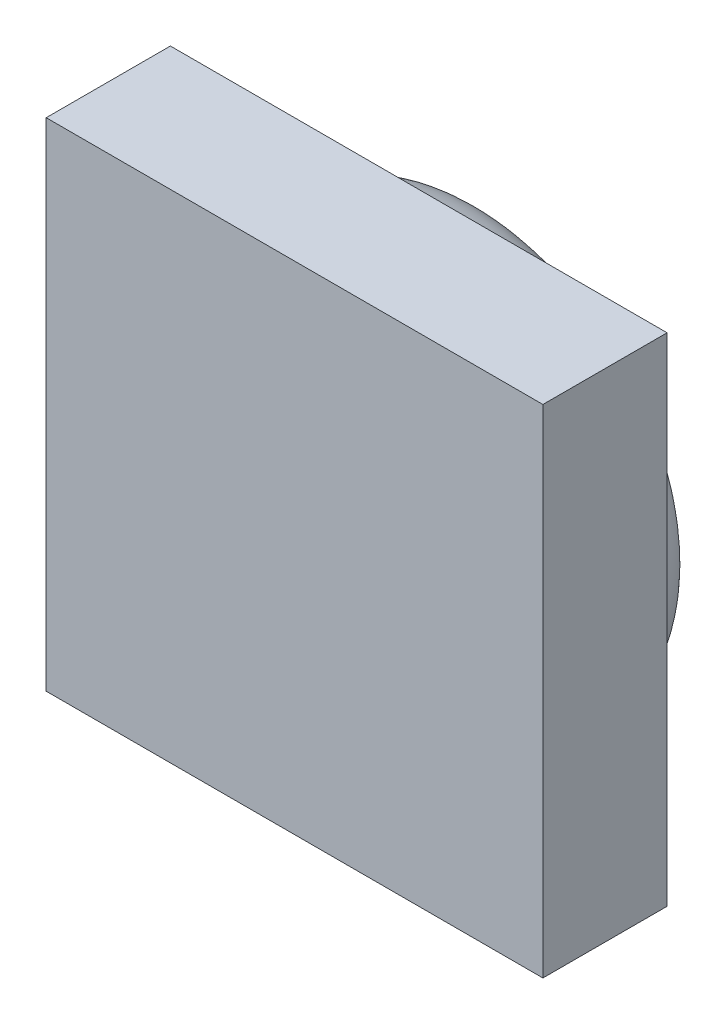
ISO-10303-21;
HEADER;
FILE_DESCRIPTION(('STEP AP214'),'2;1');
FILE_NAME('part.step','',(''),(''),'','','');
FILE_SCHEMA(('AUTOMOTIVE_DESIGN { 1 0 10303 214 1 1 1 1 }'));
ENDSEC;
DATA;
#1=APPLICATION_CONTEXT('core data for automotive mechanical design processes');
#2=APPLICATION_PROTOCOL_DEFINITION('international standard','automotive_design',2000,#1);
#3=PRODUCT_CONTEXT('',#1,'mechanical');
#4=PRODUCT('Part','Part','',(#3));
#5=PRODUCT_RELATED_PRODUCT_CATEGORY('part','',(#4));
#6=PRODUCT_DEFINITION_FORMATION('','',#4);
#7=PRODUCT_DEFINITION_CONTEXT('part definition',#1,'design');
#8=PRODUCT_DEFINITION('design','',#6,#7);
#9=PRODUCT_DEFINITION_SHAPE('','',#8);
#10=(LENGTH_UNIT() NAMED_UNIT(*) SI_UNIT(.MILLI.,.METRE.));
#11=(NAMED_UNIT(*) PLANE_ANGLE_UNIT() SI_UNIT($,.RADIAN.));
#12=(NAMED_UNIT(*) SI_UNIT($,.STERADIAN.) SOLID_ANGLE_UNIT());
#13=UNCERTAINTY_MEASURE_WITH_UNIT(LENGTH_MEASURE(1.E-05),#10,'distance_accuracy_value','');
#14=(GEOMETRIC_REPRESENTATION_CONTEXT(3) GLOBAL_UNCERTAINTY_ASSIGNED_CONTEXT((#13)) GLOBAL_UNIT_ASSIGNED_CONTEXT((#10,
#11,#12)) REPRESENTATION_CONTEXT('',''));
#15=CARTESIAN_POINT('',(0.,0.,0.));
#16=DIRECTION('',(0.,0.,1.));
#17=DIRECTION('',(1.,0.,0.));
#18=AXIS2_PLACEMENT_3D('',#15,#16,#17);
#19=CARTESIAN_POINT('',(-1.11022302462516E-13,-50.8,-50.8));
#20=DIRECTION('',(0.,0.,1.));
#21=DIRECTION('',(1.,0.,0.));
#22=AXIS2_PLACEMENT_3D('',#19,#20,#21);
#23=PLANE('',#22);
#24=DIRECTION('',(0.,-1.,0.));
#25=VECTOR('',#24,1.);
#26=CARTESIAN_POINT('',(-1.2490009027033E-13,50.8,-50.8));
#27=LINE('',#26,#25);
#28=CARTESIAN_POINT('',(-1.2490009027033E-13,50.8,-50.8));
#29=VERTEX_POINT('',#28);
#30=CARTESIAN_POINT('',(-1.11022302462516E-13,-50.8,-50.8));
#31=VERTEX_POINT('',#30);
#32=EDGE_CURVE('E99',#29,#31,#27,.T.);
#33=ORIENTED_EDGE('',*,*,#32,.F.);
#34=DIRECTION('',(-1.,0.,0.));
#35=VECTOR('',#34,1.);
#36=CARTESIAN_POINT('',(-1.2490009027033E-13,50.8,-50.8));
#37=LINE('',#36,#35);
#38=CARTESIAN_POINT('',(101.6,50.8,-50.8));
#39=VERTEX_POINT('',#38);
#40=EDGE_CURVE('E195',#39,#29,#37,.T.);
#41=ORIENTED_EDGE('',*,*,#40,.F.);
#42=DIRECTION('',(0.,1.,0.));
#43=VECTOR('',#42,1.);
#44=CARTESIAN_POINT('',(101.6,50.8,-50.8));
#45=LINE('',#44,#43);
#46=CARTESIAN_POINT('',(101.6,-50.8,-50.8));
#47=VERTEX_POINT('',#46);
#48=EDGE_CURVE('E199',#47,#39,#45,.T.);
#49=ORIENTED_EDGE('',*,*,#48,.F.);
#50=DIRECTION('',(1.,0.,0.));
#51=VECTOR('',#50,1.);
#52=CARTESIAN_POINT('',(-1.11022302462516E-13,-50.8,-50.8));
#53=LINE('',#52,#51);
#54=EDGE_CURVE('E86',#31,#47,#53,.T.);
#55=ORIENTED_EDGE('',*,*,#54,.F.);
#56=EDGE_LOOP('',(#33,#41,#49,#55));
#57=FACE_BOUND('',#56,.T.);
#58=CARTESIAN_POINT('',(50.8,0.,-50.8));
#59=DIRECTION('',(0.,0.,1.));
#60=DIRECTION('',(1.,0.,0.));
#61=AXIS2_PLACEMENT_3D('',#58,#59,#60);
#62=CIRCLE('',#61,47.625);
#63=CARTESIAN_POINT('',(98.425,0.,-50.8));
#64=VERTEX_POINT('',#63);
#65=EDGE_CURVE('E46',#64,#64,#62,.F.);
#66=ORIENTED_EDGE('',*,*,#65,.F.);
#67=EDGE_LOOP('',(#66));
#68=FACE_BOUND('',#67,.T.);
#69=ADVANCED_FACE('F38',(#57,#68),#23,.F.);
#70=CARTESIAN_POINT('',(-1.2490009027033E-13,50.8,-50.8));
#71=DIRECTION('',(-1.,0.,0.));
#72=DIRECTION('',(0.,-1.,0.));
#73=AXIS2_PLACEMENT_3D('',#70,#71,#72);
#74=PLANE('',#73);
#75=DIRECTION('',(0.,-1.,0.));
#76=VECTOR('',#75,1.);
#77=CARTESIAN_POINT('',(-1.2490009027033E-13,50.8,-25.4));
#78=LINE('',#77,#76);
#79=CARTESIAN_POINT('',(-1.2490009027033E-13,50.8,-25.4));
#80=VERTEX_POINT('',#79);
#81=CARTESIAN_POINT('',(-1.11022302462516E-13,-50.8,-25.4));
#82=VERTEX_POINT('',#81);
#83=EDGE_CURVE('E53',#80,#82,#78,.T.);
#84=ORIENTED_EDGE('',*,*,#83,.F.);
#85=DIRECTION('',(0.,0.,1.));
#86=VECTOR('',#85,1.);
#87=CARTESIAN_POINT('',(-1.2490009027033E-13,50.8,-50.8));
#88=LINE('',#87,#86);
#89=EDGE_CURVE('E192',#29,#80,#88,.T.);
#90=ORIENTED_EDGE('',*,*,#89,.F.);
#91=ORIENTED_EDGE('',*,*,#32,.T.);
#92=DIRECTION('',(0.,0.,1.));
#93=VECTOR('',#92,1.);
#94=CARTESIAN_POINT('',(-1.11022302462516E-13,-50.8,-50.8));
#95=LINE('',#94,#93);
#96=EDGE_CURVE('E91',#31,#82,#95,.T.);
#97=ORIENTED_EDGE('',*,*,#96,.T.);
#98=EDGE_LOOP('',(#84,#90,#91,#97));
#99=FACE_BOUND('',#98,.T.);
#100=ADVANCED_FACE('F40',(#99),#74,.T.);
#101=CARTESIAN_POINT('',(-1.2490009027033E-13,50.8,-50.8));
#102=DIRECTION('',(0.,1.,0.));
#103=DIRECTION('',(0.,0.,1.));
#104=AXIS2_PLACEMENT_3D('',#101,#102,#103);
#105=PLANE('',#104);
#106=DIRECTION('',(-1.,0.,0.));
#107=VECTOR('',#106,1.);
#108=CARTESIAN_POINT('',(-1.2490009027033E-13,50.8,-25.4));
#109=LINE('',#108,#107);
#110=CARTESIAN_POINT('',(101.6,50.8,-25.4));
#111=VERTEX_POINT('',#110);
#112=EDGE_CURVE('E60',#111,#80,#109,.T.);
#113=ORIENTED_EDGE('',*,*,#112,.F.);
#114=DIRECTION('',(0.,0.,1.));
#115=VECTOR('',#114,1.);
#116=CARTESIAN_POINT('',(101.6,50.8,-50.8));
#117=LINE('',#116,#115);
#118=EDGE_CURVE('E90',#39,#111,#117,.T.);
#119=ORIENTED_EDGE('',*,*,#118,.F.);
#120=ORIENTED_EDGE('',*,*,#40,.T.);
#121=ORIENTED_EDGE('',*,*,#89,.T.);
#122=EDGE_LOOP('',(#113,#119,#120,#121));
#123=FACE_BOUND('',#122,.T.);
#124=ADVANCED_FACE('F121',(#123),#105,.T.);
#125=CARTESIAN_POINT('',(101.6,50.8,-50.8));
#126=DIRECTION('',(1.,0.,0.));
#127=DIRECTION('',(0.,0.,-1.));
#128=AXIS2_PLACEMENT_3D('',#125,#126,#127);
#129=PLANE('',#128);
#130=DIRECTION('',(0.,1.,0.));
#131=VECTOR('',#130,1.);
#132=CARTESIAN_POINT('',(101.6,50.8,-25.4));
#133=LINE('',#132,#131);
#134=CARTESIAN_POINT('',(101.6,-50.8,-25.4));
#135=VERTEX_POINT('',#134);
#136=EDGE_CURVE('E94',#135,#111,#133,.T.);
#137=ORIENTED_EDGE('',*,*,#136,.F.);
#138=DIRECTION('',(0.,0.,1.));
#139=VECTOR('',#138,1.);
#140=CARTESIAN_POINT('',(101.6,-50.8,-50.8));
#141=LINE('',#140,#139);
#142=EDGE_CURVE('E82',#47,#135,#141,.T.);
#143=ORIENTED_EDGE('',*,*,#142,.F.);
#144=ORIENTED_EDGE('',*,*,#48,.T.);
#145=ORIENTED_EDGE('',*,*,#118,.T.);
#146=EDGE_LOOP('',(#137,#143,#144,#145));
#147=FACE_BOUND('',#146,.T.);
#148=ADVANCED_FACE('F95',(#147),#129,.T.);
#149=CARTESIAN_POINT('',(-1.11022302462516E-13,-50.8,-50.8));
#150=DIRECTION('',(0.,-1.,0.));
#151=DIRECTION('',(0.,0.,-1.));
#152=AXIS2_PLACEMENT_3D('',#149,#150,#151);
#153=PLANE('',#152);
#154=DIRECTION('',(1.,0.,0.));
#155=VECTOR('',#154,1.);
#156=CARTESIAN_POINT('',(-1.11022302462516E-13,-50.8,-25.4));
#157=LINE('',#156,#155);
#158=EDGE_CURVE('E11',#82,#135,#157,.T.);
#159=ORIENTED_EDGE('',*,*,#158,.F.);
#160=ORIENTED_EDGE('',*,*,#96,.F.);
#161=ORIENTED_EDGE('',*,*,#54,.T.);
#162=ORIENTED_EDGE('',*,*,#142,.T.);
#163=EDGE_LOOP('',(#159,#160,#161,#162));
#164=FACE_BOUND('',#163,.T.);
#165=ADVANCED_FACE('F84',(#164),#153,.T.);
#166=CARTESIAN_POINT('',(50.8,0.,-69.85));
#167=CARTESIAN_POINT('',(48.744283198559,0.,-69.639327299938));
#168=CARTESIAN_POINT('',(41.447496354634,0.,-68.8915424955773));
#169=CARTESIAN_POINT('',(25.798994173217,0.,-80.6517805553381));
#170=CARTESIAN_POINT('',(25.5649689018042,0.,-54.856643801103));
#171=CARTESIAN_POINT('',(9.3408075101277,0.,-68.4322523622557));
#172=CARTESIAN_POINT('',(5.51722665306121,0.,-57.4980247710525));
#173=CARTESIAN_POINT('',(3.175,0.,-50.8));
#174=B_SPLINE_CURVE_WITH_KNOTS('',3,(#166,#167,#168,#169,#170,#171,#172,#173),.UNSPECIFIED.,.F.,
.F.,(4,1,1,1,1,4),(0.,0.101350838799817,0.359745791179449,0.586373156312463,0.746622903000457,
1.),.UNSPECIFIED.);
#175=CARTESIAN_POINT('',(50.8,0.,-95.25));
#176=DIRECTION('',(0.,0.,1.));
#177=AXIS1_PLACEMENT('',#175,#176);
#178=SURFACE_OF_REVOLUTION('',#174,#177);
#179=ORIENTED_EDGE('',*,*,#65,.T.);
#180=EDGE_LOOP('',(#179));
#181=FACE_BOUND('',#180,.T.);
#182=CARTESIAN_POINT('',(50.8,0.,-69.85));
#183=VERTEX_POINT('',#182);
#184=VERTEX_LOOP('',#183);
#185=FACE_BOUND('',#184,.T.);
#186=ADVANCED_FACE('F113',(#181,#185),#178,.T.);
#187=CARTESIAN_POINT('',(-205.965067224496,-53.975,-25.4));
#188=DIRECTION('',(0.,0.,-1.));
#189=DIRECTION('',(-1.,0.,0.));
#190=AXIS2_PLACEMENT_3D('',#187,#188,#189);
#191=PLANE('',#190);
#192=ORIENTED_EDGE('',*,*,#112,.T.);
#193=ORIENTED_EDGE('',*,*,#83,.T.);
#194=ORIENTED_EDGE('',*,*,#158,.T.);
#195=ORIENTED_EDGE('',*,*,#136,.T.);
#196=EDGE_LOOP('',(#192,#193,#194,#195));
#197=FACE_BOUND('',#196,.T.);
#198=ADVANCED_FACE('F98',(#197),#191,.F.);
#199=CLOSED_SHELL('',(#69,#100,#124,#148,#165,#186,#198));
#200=MANIFOLD_SOLID_BREP('B2',#199);
#201=ADVANCED_BREP_SHAPE_REPRESENTATION('',(#18,#200),#14);
#202=SHAPE_DEFINITION_REPRESENTATION(#9,#201);
ENDSEC;
END-ISO-10303-21;
